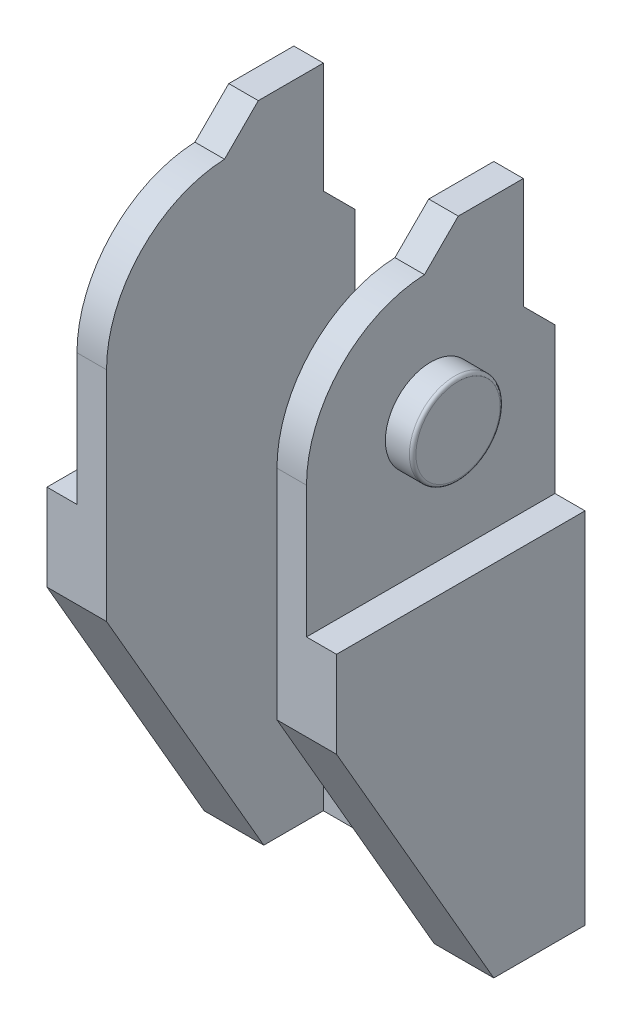
ISO-10303-21;
HEADER;
FILE_DESCRIPTION(('STEP AP214'),'2;1');
FILE_NAME('part.step','',(''),(''),'','','');
FILE_SCHEMA(('AUTOMOTIVE_DESIGN { 1 0 10303 214 1 1 1 1 }'));
ENDSEC;
DATA;
#1=APPLICATION_CONTEXT('core data for automotive mechanical design processes');
#2=APPLICATION_PROTOCOL_DEFINITION('international standard','automotive_design',2000,#1);
#3=PRODUCT_CONTEXT('',#1,'mechanical');
#4=PRODUCT('Part','Part','',(#3));
#5=PRODUCT_RELATED_PRODUCT_CATEGORY('part','',(#4));
#6=PRODUCT_DEFINITION_FORMATION('','',#4);
#7=PRODUCT_DEFINITION_CONTEXT('part definition',#1,'design');
#8=PRODUCT_DEFINITION('design','',#6,#7);
#9=PRODUCT_DEFINITION_SHAPE('','',#8);
#10=(LENGTH_UNIT() NAMED_UNIT(*) SI_UNIT(.MILLI.,.METRE.));
#11=(NAMED_UNIT(*) PLANE_ANGLE_UNIT() SI_UNIT($,.RADIAN.));
#12=(NAMED_UNIT(*) SI_UNIT($,.STERADIAN.) SOLID_ANGLE_UNIT());
#13=UNCERTAINTY_MEASURE_WITH_UNIT(LENGTH_MEASURE(1.E-05),#10,'distance_accuracy_value','');
#14=(GEOMETRIC_REPRESENTATION_CONTEXT(3) GLOBAL_UNCERTAINTY_ASSIGNED_CONTEXT((#13)) GLOBAL_UNIT_ASSIGNED_CONTEXT((#10,
#11,#12)) REPRESENTATION_CONTEXT('',''));
#15=CARTESIAN_POINT('',(0.,0.,0.));
#16=DIRECTION('',(0.,0.,1.));
#17=DIRECTION('',(1.,0.,0.));
#18=AXIS2_PLACEMENT_3D('',#15,#16,#17);
#19=CARTESIAN_POINT('',(5.25,2.16750000000027,15.31));
#20=DIRECTION('',(0.,0.,-1.));
#21=DIRECTION('',(-1.,0.,0.));
#22=AXIS2_PLACEMENT_3D('',#19,#20,#21);
#23=PLANE('',#22);
#24=DIRECTION('',(-1.,0.,0.));
#25=VECTOR('',#24,1.);
#26=CARTESIAN_POINT('',(8.92000000000003,10.2629827702437,15.3100000000815));
#27=LINE('',#26,#25);
#28=CARTESIAN_POINT('',(7.07,10.2629827702437,15.3100000000815));
#29=VERTEX_POINT('',#28);
#30=CARTESIAN_POINT('',(5.25,10.2629827702437,15.3100000000816));
#31=VERTEX_POINT('',#30);
#32=EDGE_CURVE('E256',#29,#31,#27,.T.);
#33=ORIENTED_EDGE('',*,*,#32,.T.);
#34=DIRECTION('',(0.,-1.,0.));
#35=VECTOR('',#34,1.);
#36=CARTESIAN_POINT('',(5.25,10.2629827701717,15.31));
#37=LINE('',#36,#35);
#38=CARTESIAN_POINT('',(5.25,-3.16749999999971,15.31));
#39=VERTEX_POINT('',#38);
#40=EDGE_CURVE('E359',#31,#39,#37,.T.);
#41=ORIENTED_EDGE('',*,*,#40,.T.);
#42=DIRECTION('',(-1.,0.,0.));
#43=VECTOR('',#42,1.);
#44=CARTESIAN_POINT('',(5.25,-3.16749999999971,15.31));
#45=LINE('',#44,#43);
#46=CARTESIAN_POINT('',(8.92000000000003,-3.16749999999971,15.3099999999999));
#47=VERTEX_POINT('',#46);
#48=EDGE_CURVE('E429',#47,#39,#45,.T.);
#49=ORIENTED_EDGE('',*,*,#48,.F.);
#50=DIRECTION('',(0.,-1.,0.));
#51=VECTOR('',#50,1.);
#52=CARTESIAN_POINT('',(8.92000000000003,2.16750000000027,15.31));
#53=LINE('',#52,#51);
#54=CARTESIAN_POINT('',(8.92000000000003,2.16750000000027,15.31));
#55=VERTEX_POINT('',#54);
#56=EDGE_CURVE('E410',#55,#47,#53,.T.);
#57=ORIENTED_EDGE('',*,*,#56,.F.);
#58=DIRECTION('',(1.,0.,0.));
#59=VECTOR('',#58,1.);
#60=CARTESIAN_POINT('',(7.07,2.16750000000027,15.3099999999999));
#61=LINE('',#60,#59);
#62=CARTESIAN_POINT('',(7.07,2.16750000000027,15.3099999999999));
#63=VERTEX_POINT('',#62);
#64=EDGE_CURVE('E294',#63,#55,#61,.T.);
#65=ORIENTED_EDGE('',*,*,#64,.F.);
#66=DIRECTION('',(0.,-1.,0.));
#67=VECTOR('',#66,1.);
#68=CARTESIAN_POINT('',(7.07,10.2629827701717,15.3099999999999));
#69=LINE('',#68,#67);
#70=EDGE_CURVE('E280',#29,#63,#69,.T.);
#71=ORIENTED_EDGE('',*,*,#70,.F.);
#72=EDGE_LOOP('',(#33,#41,#49,#57,#65,#71));
#73=FACE_BOUND('',#72,.T.);
#74=ADVANCED_FACE('F55',(#73),#23,.F.);
#75=CARTESIAN_POINT('',(5.25,-19.9474726521631,5.62207827597019));
#76=DIRECTION('',(0.,-0.499999999857117,0.866025403866932));
#77=DIRECTION('',(0.,-0.866025403866932,-0.499999999857117));
#78=AXIS2_PLACEMENT_3D('',#75,#76,#77);
#79=PLANE('',#78);
#80=DIRECTION('',(1.,0.,0.));
#81=VECTOR('',#80,1.);
#82=CARTESIAN_POINT('',(-8.92000000000002,-19.9474999999997,5.62206248299804));
#83=LINE('',#82,#81);
#84=CARTESIAN_POINT('',(-8.92000000000002,-19.9474999999997,5.62206248299804));
#85=VERTEX_POINT('',#84);
#86=CARTESIAN_POINT('',(-5.25000000000002,-19.9474999999997,5.62206248484359));
#87=VERTEX_POINT('',#86);
#88=EDGE_CURVE('E406',#85,#87,#83,.T.);
#89=ORIENTED_EDGE('',*,*,#88,.T.);
#90=DIRECTION('',(0.,-0.866025403784439,-0.5));
#91=VECTOR('',#90,1.);
#92=CARTESIAN_POINT('',(-5.25000000000003,-3.16749999999971,15.3099999999999));
#93=LINE('',#92,#91);
#94=CARTESIAN_POINT('',(-5.25000000000003,-3.16749999999971,15.3099999999999));
#95=VERTEX_POINT('',#94);
#96=EDGE_CURVE('E367',#95,#87,#93,.T.);
#97=ORIENTED_EDGE('',*,*,#96,.F.);
#98=CARTESIAN_POINT('',(-8.92000000000002,-3.16749999999971,15.31));
#99=VERTEX_POINT('',#98);
#100=EDGE_CURVE('E435',#95,#99,#45,.T.);
#101=ORIENTED_EDGE('',*,*,#100,.T.);
#102=DIRECTION('',(0.,0.866025403784438,0.500000000000001));
#103=VECTOR('',#102,1.);
#104=CARTESIAN_POINT('',(-8.92000000000002,-3.16749999999971,15.31));
#105=LINE('',#104,#103);
#106=EDGE_CURVE('E402',#85,#99,#105,.T.);
#107=ORIENTED_EDGE('',*,*,#106,.F.);
#108=EDGE_LOOP('',(#89,#97,#101,#107));
#109=FACE_BOUND('',#108,.T.);
#110=ADVANCED_FACE('F989',(#109),#79,.T.);
#111=DIRECTION('',(0.,-1.,0.));
#112=VECTOR('',#111,1.);
#113=CARTESIAN_POINT('',(-5.25000000000003,19.9475000000003,15.3099999999999));
#114=LINE('',#113,#112);
#115=CARTESIAN_POINT('',(-5.25000000000003,10.2629827701656,15.3099999999999));
#116=VERTEX_POINT('',#115);
#117=EDGE_CURVE('E363',#116,#95,#114,.T.);
#118=ORIENTED_EDGE('',*,*,#117,.F.);
#119=DIRECTION('',(1.,0.,0.));
#120=VECTOR('',#119,1.);
#121=CARTESIAN_POINT('',(-8.92000000000003,10.2629827701656,15.31));
#122=LINE('',#121,#120);
#123=CARTESIAN_POINT('',(-7.07000000000003,10.2629827701656,15.3099999999999));
#124=VERTEX_POINT('',#123);
#125=EDGE_CURVE('E322',#124,#116,#122,.T.);
#126=ORIENTED_EDGE('',*,*,#125,.F.);
#127=DIRECTION('',(0.,-1.,0.));
#128=VECTOR('',#127,1.);
#129=CARTESIAN_POINT('',(-7.07000000000003,19.9475000000003,15.3099999999999));
#130=LINE('',#129,#128);
#131=CARTESIAN_POINT('',(-7.07000000000003,2.16750000000027,15.31));
#132=VERTEX_POINT('',#131);
#133=EDGE_CURVE('E332',#124,#132,#130,.T.);
#134=ORIENTED_EDGE('',*,*,#133,.T.);
#135=DIRECTION('',(-1.,0.,0.));
#136=VECTOR('',#135,1.);
#137=CARTESIAN_POINT('',(-7.07000000000003,2.16750000000027,15.31));
#138=LINE('',#137,#136);
#139=CARTESIAN_POINT('',(-8.92000000000002,2.16750000000027,15.31));
#140=VERTEX_POINT('',#139);
#141=EDGE_CURVE('E335',#132,#140,#138,.T.);
#142=ORIENTED_EDGE('',*,*,#141,.T.);
#143=DIRECTION('',(0.,1.,0.));
#144=VECTOR('',#143,1.);
#145=CARTESIAN_POINT('',(-8.92000000000002,2.16750000000027,15.31));
#146=LINE('',#145,#144);
#147=EDGE_CURVE('E390',#99,#140,#146,.T.);
#148=ORIENTED_EDGE('',*,*,#147,.F.);
#149=ORIENTED_EDGE('',*,*,#100,.F.);
#150=EDGE_LOOP('',(#118,#126,#134,#142,#148,#149));
#151=FACE_BOUND('',#150,.T.);
#152=ADVANCED_FACE('F992',(#151),#23,.F.);
#153=CARTESIAN_POINT('',(0.,19.9475,-1.38777878078145E-13));
#154=DIRECTION('',(0.,-1.,0.));
#155=DIRECTION('',(0.,0.,-1.));
#156=AXIS2_PLACEMENT_3D('',#153,#154,#155);
#157=PLANE('',#156);
#158=DIRECTION('',(0.,0.,1.));
#159=VECTOR('',#158,1.);
#160=CARTESIAN_POINT('',(-5.25000000000002,19.9475000000003,5.9598041020909));
#161=LINE('',#160,#159);
#162=CARTESIAN_POINT('',(-5.25000000000002,19.9475000000002,1.94999999999987));
#163=VERTEX_POINT('',#162);
#164=CARTESIAN_POINT('',(-5.25000000000002,19.9474999999206,5.95980410201125));
#165=VERTEX_POINT('',#164);
#166=EDGE_CURVE('E360',#163,#165,#161,.T.);
#167=ORIENTED_EDGE('',*,*,#166,.F.);
#168=DIRECTION('',(1.,0.,0.));
#169=VECTOR('',#168,1.);
#170=CARTESIAN_POINT('',(-8.92000000000003,19.9475000000002,1.94999999999998));
#171=LINE('',#170,#169);
#172=CARTESIAN_POINT('',(-7.07000000000003,19.9475000000002,1.94999999999987));
#173=VERTEX_POINT('',#172);
#174=EDGE_CURVE('E229',#173,#163,#171,.T.);
#175=ORIENTED_EDGE('',*,*,#174,.F.);
#176=DIRECTION('',(0.,0.,-1.));
#177=VECTOR('',#176,1.);
#178=CARTESIAN_POINT('',(-7.07000000000003,19.9475000000003,15.3099999999999));
#179=LINE('',#178,#177);
#180=CARTESIAN_POINT('',(-7.07000000000003,19.9475000000003,5.95980410193159));
#181=VERTEX_POINT('',#180);
#182=EDGE_CURVE('E340',#181,#173,#179,.T.);
#183=ORIENTED_EDGE('',*,*,#182,.F.);
#184=DIRECTION('',(1.,0.,0.));
#185=VECTOR('',#184,1.);
#186=CARTESIAN_POINT('',(-8.92000000000004,19.9474999999206,5.95980410201136));
#187=LINE('',#186,#185);
#188=EDGE_CURVE('E326',#181,#165,#187,.T.);
#189=ORIENTED_EDGE('',*,*,#188,.T.);
#190=EDGE_LOOP('',(#167,#175,#183,#189));
#191=FACE_BOUND('',#190,.T.);
#192=ADVANCED_FACE('F1001',(#191),#157,.F.);
#193=CARTESIAN_POINT('',(0.,0.,0.));
#194=DIRECTION('',(0.,0.,1.));
#195=DIRECTION('',(1.,0.,0.));
#196=AXIS2_PLACEMENT_3D('',#193,#194,#195);
#197=PLANE('',#196);
#198=CARTESIAN_POINT('',(0.,-3.94713921133028,-2.16705264843853E-08));
#199=DIRECTION('',(0.,0.,1.));
#200=DIRECTION('',(1.,0.,0.));
#201=AXIS2_PLACEMENT_3D('',#198,#199,#200);
#202=CIRCLE('',#201,1.7);
#203=CARTESIAN_POINT('',(1.7,-3.94713921133028,-2.16705266979271E-08));
#204=VERTEX_POINT('',#203);
#205=EDGE_CURVE('E233',#204,#204,#202,.T.);
#206=ORIENTED_EDGE('',*,*,#205,.T.);
#207=EDGE_LOOP('',(#206));
#208=FACE_BOUND('',#207,.T.);
#209=CARTESIAN_POINT('',(0.,-12.9471392113303,-2.16704154620828E-08));
#210=DIRECTION('',(0.,0.,1.));
#211=DIRECTION('',(1.,0.,0.));
#212=AXIS2_PLACEMENT_3D('',#209,#210,#211);
#213=CIRCLE('',#212,1.7);
#214=CARTESIAN_POINT('',(1.7,-12.9471392113303,-2.16704156756247E-08));
#215=VERTEX_POINT('',#214);
#216=EDGE_CURVE('E1480',#215,#215,#213,.T.);
#217=ORIENTED_EDGE('',*,*,#216,.T.);
#218=EDGE_LOOP('',(#217));
#219=FACE_BOUND('',#218,.T.);
#220=DIRECTION('',(0.,-1.,0.));
#221=VECTOR('',#220,1.);
#222=CARTESIAN_POINT('',(-7.07000000000003,11.1675,-1.38777878078145E-13));
#223=LINE('',#222,#221);
#224=CARTESIAN_POINT('',(-7.07000000000003,11.1675,-1.38777878078145E-13));
#225=VERTEX_POINT('',#224);
#226=CARTESIAN_POINT('',(-7.07000000000003,2.16749999999999,-1.38777878078145E-13));
#227=VERTEX_POINT('',#226);
#228=EDGE_CURVE('E325',#225,#227,#223,.T.);
#229=ORIENTED_EDGE('',*,*,#228,.F.);
#230=DIRECTION('',(1.,0.,0.));
#231=VECTOR('',#230,1.);
#232=CARTESIAN_POINT('',(-8.92000000000003,11.1675,0.));
#233=LINE('',#232,#231);
#234=CARTESIAN_POINT('',(-5.25000000000002,11.1675,-1.38777878078145E-13));
#235=VERTEX_POINT('',#234);
#236=EDGE_CURVE('E71',#225,#235,#233,.T.);
#237=ORIENTED_EDGE('',*,*,#236,.T.);
#238=DIRECTION('',(0.,1.,0.));
#239=VECTOR('',#238,1.);
#240=CARTESIAN_POINT('',(-5.25000000000002,6.5672777077096,-2.16705264843853E-08));
#241=LINE('',#240,#239);
#242=CARTESIAN_POINT('',(-5.25000000000002,6.5672777077096,-2.16705264843853E-08));
#243=VERTEX_POINT('',#242);
#244=EDGE_CURVE('E239',#243,#235,#241,.T.);
#245=ORIENTED_EDGE('',*,*,#244,.F.);
#246=DIRECTION('',(1.,0.,0.));
#247=VECTOR('',#246,1.);
#248=CARTESIAN_POINT('',(-5.25000000000002,6.5672777077096,-2.16705264843853E-08));
#249=LINE('',#248,#247);
#250=CARTESIAN_POINT('',(5.25,6.5672777077096,-2.16703877065072E-08));
#251=VERTEX_POINT('',#250);
#252=EDGE_CURVE('E386',#243,#251,#249,.T.);
#253=ORIENTED_EDGE('',*,*,#252,.T.);
#254=DIRECTION('',(0.,1.,0.));
#255=VECTOR('',#254,1.);
#256=CARTESIAN_POINT('',(5.24999999999998,11.1672777077096,-2.16703877065072E-08));
#257=LINE('',#256,#255);
#258=CARTESIAN_POINT('',(5.24999999999998,11.1675,0.));
#259=VERTEX_POINT('',#258);
#260=EDGE_CURVE('E364',#251,#259,#257,.T.);
#261=ORIENTED_EDGE('',*,*,#260,.T.);
#262=DIRECTION('',(1.,0.,0.));
#263=VECTOR('',#262,1.);
#264=CARTESIAN_POINT('',(-8.92100000000002,11.1675,0.));
#265=LINE('',#264,#263);
#266=CARTESIAN_POINT('',(7.07,11.1675,-1.38777878078145E-13));
#267=VERTEX_POINT('',#266);
#268=EDGE_CURVE('E277',#259,#267,#265,.T.);
#269=ORIENTED_EDGE('',*,*,#268,.T.);
#270=DIRECTION('',(0.,-1.,0.));
#271=VECTOR('',#270,1.);
#272=CARTESIAN_POINT('',(7.07,19.9475,-2.16705542399609E-08));
#273=LINE('',#272,#271);
#274=CARTESIAN_POINT('',(7.07,2.16749999999999,-2.16705264843853E-08));
#275=VERTEX_POINT('',#274);
#276=EDGE_CURVE('E290',#267,#275,#273,.T.);
#277=ORIENTED_EDGE('',*,*,#276,.T.);
#278=DIRECTION('',(1.,0.,0.));
#279=VECTOR('',#278,1.);
#280=CARTESIAN_POINT('',(7.07,2.16749999999999,-2.16705264843853E-08));
#281=LINE('',#280,#279);
#282=CARTESIAN_POINT('',(8.92000000000003,2.16749999999999,-2.16704154620828E-08));
#283=VERTEX_POINT('',#282);
#284=EDGE_CURVE('E293',#275,#283,#281,.T.);
#285=ORIENTED_EDGE('',*,*,#284,.T.);
#286=DIRECTION('',(0.,1.,0.));
#287=VECTOR('',#286,1.);
#288=CARTESIAN_POINT('',(8.92000000000003,2.16749999999999,0.));
#289=LINE('',#288,#287);
#290=CARTESIAN_POINT('',(8.92000000000003,-19.9475,-1.38777878078145E-13));
#291=VERTEX_POINT('',#290);
#292=EDGE_CURVE('E420',#291,#283,#289,.T.);
#293=ORIENTED_EDGE('',*,*,#292,.F.);
#294=DIRECTION('',(-1.,0.,0.));
#295=VECTOR('',#294,1.);
#296=CARTESIAN_POINT('',(-5.25000000000002,-19.9475,-1.38777878078145E-13));
#297=LINE('',#296,#295);
#298=CARTESIAN_POINT('',(-8.92000000000002,-19.9475,0.));
#299=VERTEX_POINT('',#298);
#300=EDGE_CURVE('E428',#291,#299,#297,.T.);
#301=ORIENTED_EDGE('',*,*,#300,.T.);
#302=DIRECTION('',(0.,-1.,0.));
#303=VECTOR('',#302,1.);
#304=CARTESIAN_POINT('',(-8.92000000000003,2.16749999999999,0.));
#305=LINE('',#304,#303);
#306=CARTESIAN_POINT('',(-8.92000000000003,2.16749999999999,0.));
#307=VERTEX_POINT('',#306);
#308=EDGE_CURVE('E396',#307,#299,#305,.T.);
#309=ORIENTED_EDGE('',*,*,#308,.F.);
#310=DIRECTION('',(-1.,0.,0.));
#311=VECTOR('',#310,1.);
#312=CARTESIAN_POINT('',(-7.07000000000003,2.16749999999999,-1.38777878078145E-13));
#313=LINE('',#312,#311);
#314=EDGE_CURVE('E336',#227,#307,#313,.T.);
#315=ORIENTED_EDGE('',*,*,#314,.F.);
#316=EDGE_LOOP('',(#229,#237,#245,#253,#261,#269,#277,#285,#293,#301,#309,#315));
#317=FACE_BOUND('',#316,.T.);
#318=ADVANCED_FACE('F1006',(#208,#219,#317),#197,.F.);
#319=DIRECTION('',(0.,-0.866025403784439,-0.5));
#320=VECTOR('',#319,1.);
#321=CARTESIAN_POINT('',(5.25,-3.16749999999971,15.31));
#322=LINE('',#321,#320);
#323=CARTESIAN_POINT('',(5.25,-19.9474999999997,5.6220624848437));
#324=VERTEX_POINT('',#323);
#325=EDGE_CURVE('E377',#39,#324,#322,.T.);
#326=ORIENTED_EDGE('',*,*,#325,.T.);
#327=DIRECTION('',(-1.,0.,0.));
#328=VECTOR('',#327,1.);
#329=CARTESIAN_POINT('',(8.92000000000002,-19.9474999999997,5.62206248299793));
#330=LINE('',#329,#328);
#331=CARTESIAN_POINT('',(8.92000000000002,-19.9474999999997,5.62206248299793));
#332=VERTEX_POINT('',#331);
#333=EDGE_CURVE('E424',#332,#324,#330,.T.);
#334=ORIENTED_EDGE('',*,*,#333,.F.);
#335=DIRECTION('',(0.,-0.866025403784438,-0.500000000000001));
#336=VECTOR('',#335,1.);
#337=CARTESIAN_POINT('',(8.92000000000002,-19.9474999999997,5.62206248299793));
#338=LINE('',#337,#336);
#339=EDGE_CURVE('E413',#47,#332,#338,.T.);
#340=ORIENTED_EDGE('',*,*,#339,.F.);
#341=ORIENTED_EDGE('',*,*,#48,.T.);
#342=EDGE_LOOP('',(#326,#334,#340,#341));
#343=FACE_BOUND('',#342,.T.);
#344=ADVANCED_FACE('F998',(#343),#79,.T.);
#345=CARTESIAN_POINT('',(-5.25000000000002,-19.9475,-1.38777878078145E-13));
#346=DIRECTION('',(0.,1.,0.));
#347=DIRECTION('',(0.,0.,1.));
#348=AXIS2_PLACEMENT_3D('',#345,#346,#347);
#349=PLANE('',#348);
#350=DIRECTION('',(1.,0.,0.));
#351=VECTOR('',#350,1.);
#352=CARTESIAN_POINT('',(-5.25000000000002,-19.9474999999997,1.94999997832951));
#353=LINE('',#352,#351);
#354=CARTESIAN_POINT('',(-5.25000000000002,-19.9474999999997,1.94999997832951));
#355=VERTEX_POINT('',#354);
#356=CARTESIAN_POINT('',(5.25,-19.9474999999997,1.94999997832962));
#357=VERTEX_POINT('',#356);
#358=EDGE_CURVE('E434',#355,#357,#353,.T.);
#359=ORIENTED_EDGE('',*,*,#358,.F.);
#360=DIRECTION('',(0.,0.,-1.));
#361=VECTOR('',#360,1.);
#362=CARTESIAN_POINT('',(-5.25000000000002,-19.9475,-1.38777878078145E-13));
#363=LINE('',#362,#361);
#364=EDGE_CURVE('E926',#87,#355,#363,.T.);
#365=ORIENTED_EDGE('',*,*,#364,.F.);
#366=ORIENTED_EDGE('',*,*,#88,.F.);
#367=DIRECTION('',(0.,0.,1.));
#368=VECTOR('',#367,1.);
#369=CARTESIAN_POINT('',(-8.92000000000002,-19.9474999999997,5.62206248299804));
#370=LINE('',#369,#368);
#371=EDGE_CURVE('E399',#299,#85,#370,.T.);
#372=ORIENTED_EDGE('',*,*,#371,.F.);
#373=ORIENTED_EDGE('',*,*,#300,.F.);
#374=DIRECTION('',(0.,0.,-1.));
#375=VECTOR('',#374,1.);
#376=CARTESIAN_POINT('',(8.92000000000003,-19.9475,-1.38777878078145E-13));
#377=LINE('',#376,#375);
#378=EDGE_CURVE('E416',#332,#291,#377,.T.);
#379=ORIENTED_EDGE('',*,*,#378,.F.);
#380=ORIENTED_EDGE('',*,*,#333,.T.);
#381=DIRECTION('',(0.,0.,1.));
#382=VECTOR('',#381,1.);
#383=CARTESIAN_POINT('',(5.25,-19.9475,0.));
#384=LINE('',#383,#382);
#385=EDGE_CURVE('E922',#324,#357,#384,.F.);
#386=ORIENTED_EDGE('',*,*,#385,.T.);
#387=EDGE_LOOP('',(#359,#365,#366,#372,#373,#379,#380,#386));
#388=FACE_BOUND('',#387,.T.);
#389=ADVANCED_FACE('F1022',(#388),#349,.F.);
#390=CARTESIAN_POINT('',(8.92000000000003,0.,0.));
#391=DIRECTION('',(-1.,0.,0.));
#392=DIRECTION('',(0.,0.,1.));
#393=AXIS2_PLACEMENT_3D('',#390,#391,#392);
#394=PLANE('',#393);
#395=ORIENTED_EDGE('',*,*,#292,.T.);
#396=DIRECTION('',(0.,0.,1.));
#397=VECTOR('',#396,1.);
#398=CARTESIAN_POINT('',(8.92000000000003,2.16749999999999,-2.16704154620828E-08));
#399=LINE('',#398,#397);
#400=EDGE_CURVE('E303',#283,#55,#399,.T.);
#401=ORIENTED_EDGE('',*,*,#400,.T.);
#402=ORIENTED_EDGE('',*,*,#56,.T.);
#403=ORIENTED_EDGE('',*,*,#339,.T.);
#404=ORIENTED_EDGE('',*,*,#378,.T.);
#405=EDGE_LOOP('',(#395,#401,#402,#403,#404));
#406=FACE_BOUND('',#405,.T.);
#407=ADVANCED_FACE('F1045',(#406),#394,.F.);
#408=CARTESIAN_POINT('',(-8.92000000000003,0.,0.));
#409=DIRECTION('',(1.,0.,0.));
#410=DIRECTION('',(0.,0.,-1.));
#411=AXIS2_PLACEMENT_3D('',#408,#409,#410);
#412=PLANE('',#411);
#413=ORIENTED_EDGE('',*,*,#147,.T.);
#414=DIRECTION('',(0.,0.,-1.));
#415=VECTOR('',#414,1.);
#416=CARTESIAN_POINT('',(-8.92000000000002,2.16750000000027,15.31));
#417=LINE('',#416,#415);
#418=EDGE_CURVE('E345',#140,#307,#417,.T.);
#419=ORIENTED_EDGE('',*,*,#418,.T.);
#420=ORIENTED_EDGE('',*,*,#308,.T.);
#421=ORIENTED_EDGE('',*,*,#371,.T.);
#422=ORIENTED_EDGE('',*,*,#106,.T.);
#423=EDGE_LOOP('',(#413,#419,#420,#421,#422));
#424=FACE_BOUND('',#423,.T.);
#425=ADVANCED_FACE('F1041',(#424),#412,.F.);
#426=CARTESIAN_POINT('',(5.25,4.61727770770953,-2.16703877065072E-08));
#427=DIRECTION('',(1.,0.,0.));
#428=DIRECTION('',(0.,0.,-1.));
#429=AXIS2_PLACEMENT_3D('',#426,#427,#428);
#430=PLANE('',#429);
#431=ORIENTED_EDGE('',*,*,#40,.F.);
#432=CARTESIAN_POINT('',(5.25,10.2629827702435,7.70105335394347));
#433=DIRECTION('',(1.,0.,0.));
#434=DIRECTION('',(0.,0.,-1.));
#435=AXIS2_PLACEMENT_3D('',#432,#433,#434);
#436=CIRCLE('',#435,7.60894664613818);
#437=CARTESIAN_POINT('',(5.24999999999999,17.8642390521744,8.04306504991667));
#438=VERTEX_POINT('',#437);
#439=EDGE_CURVE('E248',#438,#31,#436,.T.);
#440=ORIENTED_EDGE('',*,*,#439,.F.);
#441=DIRECTION('',(0.,-0.707106781186543,0.707106781186552));
#442=VECTOR('',#441,1.);
#443=CARTESIAN_POINT('',(5.24999999999998,19.9475000000003,5.95980410209101));
#444=LINE('',#443,#442);
#445=CARTESIAN_POINT('',(5.24999999999998,19.9475000000003,5.95980410209101));
#446=VERTEX_POINT('',#445);
#447=EDGE_CURVE('E253',#446,#438,#444,.T.);
#448=ORIENTED_EDGE('',*,*,#447,.F.);
#449=DIRECTION('',(0.,0.,1.));
#450=VECTOR('',#449,1.);
#451=CARTESIAN_POINT('',(5.25,19.9475000000002,1.94999999999998));
#452=LINE('',#451,#450);
#453=CARTESIAN_POINT('',(5.25,19.9475000000002,1.94999999999998));
#454=VERTEX_POINT('',#453);
#455=EDGE_CURVE('E349',#454,#446,#452,.T.);
#456=ORIENTED_EDGE('',*,*,#455,.F.);
#457=DIRECTION('',(0.,1.,0.));
#458=VECTOR('',#457,1.);
#459=CARTESIAN_POINT('',(5.25,19.9475000000002,1.94999999999998));
#460=LINE('',#459,#458);
#461=CARTESIAN_POINT('',(5.25,13.1175000000003,1.94999999999998));
#462=VERTEX_POINT('',#461);
#463=EDGE_CURVE('E270',#462,#454,#460,.T.);
#464=ORIENTED_EDGE('',*,*,#463,.F.);
#465=DIRECTION('',(0.,0.707106781186546,0.707106781186549));
#466=VECTOR('',#465,1.);
#467=CARTESIAN_POINT('',(5.25,13.1175000000003,1.94999999999998));
#468=LINE('',#467,#466);
#469=EDGE_CURVE('E266',#259,#462,#468,.T.);
#470=ORIENTED_EDGE('',*,*,#469,.F.);
#471=ORIENTED_EDGE('',*,*,#260,.F.);
#472=CARTESIAN_POINT('',(5.25,4.61727770770953,-2.16703877065072E-08));
#473=DIRECTION('',(-1.,0.,0.));
#474=DIRECTION('',(0.,0.,-1.));
#475=AXIS2_PLACEMENT_3D('',#472,#473,#474);
#476=CIRCLE('',#475,1.95000000000003);
#477=CARTESIAN_POINT('',(5.25,4.61727770770981,1.94999997832965));
#478=VERTEX_POINT('',#477);
#479=EDGE_CURVE('E378',#478,#251,#476,.T.);
#480=ORIENTED_EDGE('',*,*,#479,.F.);
#481=DIRECTION('',(0.,1.,0.));
#482=VECTOR('',#481,1.);
#483=CARTESIAN_POINT('',(5.25,-19.9474726505648,1.94999997832962));
#484=LINE('',#483,#482);
#485=EDGE_CURVE('E382',#357,#478,#484,.T.);
#486=ORIENTED_EDGE('',*,*,#485,.F.);
#487=ORIENTED_EDGE('',*,*,#385,.F.);
#488=ORIENTED_EDGE('',*,*,#325,.F.);
#489=EDGE_LOOP('',(#431,#440,#448,#456,#464,#470,#471,#480,#486,#487,#488));
#490=FACE_BOUND('',#489,.T.);
#491=ADVANCED_FACE('F1054',(#490),#430,.F.);
#492=CARTESIAN_POINT('',(-5.25000000000002,4.61727770770953,-2.16704154620828E-08));
#493=DIRECTION('',(1.,0.,0.));
#494=DIRECTION('',(0.,0.,-1.));
#495=AXIS2_PLACEMENT_3D('',#492,#493,#494);
#496=CYLINDRICAL_SURFACE('',#495,1.95000000000003);
#497=ORIENTED_EDGE('',*,*,#479,.T.);
#498=ORIENTED_EDGE('',*,*,#252,.F.);
#499=CARTESIAN_POINT('',(-5.25000000000002,4.61727770770953,-2.16704154620828E-08));
#500=DIRECTION('',(-1.,0.,0.));
#501=DIRECTION('',(0.,0.,-1.));
#502=AXIS2_PLACEMENT_3D('',#499,#500,#501);
#503=CIRCLE('',#502,1.95000000000003);
#504=CARTESIAN_POINT('',(-5.25000000000002,4.61727770770981,1.94999997832962));
#505=VERTEX_POINT('',#504);
#506=EDGE_CURVE('E368',#505,#243,#503,.T.);
#507=ORIENTED_EDGE('',*,*,#506,.F.);
#508=DIRECTION('',(1.,0.,0.));
#509=VECTOR('',#508,1.);
#510=CARTESIAN_POINT('',(-5.25000000000002,4.61727770770981,1.94999997832962));
#511=LINE('',#510,#509);
#512=EDGE_CURVE('E374',#505,#478,#511,.T.);
#513=ORIENTED_EDGE('',*,*,#512,.T.);
#514=EDGE_LOOP('',(#497,#498,#507,#513));
#515=FACE_BOUND('',#514,.T.);
#516=ADVANCED_FACE('F1029',(#515),#496,.T.);
#517=CARTESIAN_POINT('',(-5.25000000000002,-19.9474726505648,1.94999997832951));
#518=DIRECTION('',(0.,0.,-1.));
#519=DIRECTION('',(0.,1.,0.));
#520=AXIS2_PLACEMENT_3D('',#517,#518,#519);
#521=PLANE('',#520);
#522=CARTESIAN_POINT('',(0.,-3.94713921133005,1.94999997832951));
#523=DIRECTION('',(0.,0.,1.));
#524=DIRECTION('',(1.,0.,0.));
#525=AXIS2_PLACEMENT_3D('',#522,#523,#524);
#526=CIRCLE('',#525,1.7);
#527=CARTESIAN_POINT('',(1.69999999999999,-3.94713921133005,1.94999997832951));
#528=VERTEX_POINT('',#527);
#529=EDGE_CURVE('E1483',#528,#528,#526,.T.);
#530=ORIENTED_EDGE('',*,*,#529,.F.);
#531=EDGE_LOOP('',(#530));
#532=FACE_BOUND('',#531,.T.);
#533=CARTESIAN_POINT('',(0.,-12.9471392113301,1.94999997832962));
#534=DIRECTION('',(0.,0.,1.));
#535=DIRECTION('',(1.,0.,0.));
#536=AXIS2_PLACEMENT_3D('',#533,#534,#535);
#537=CIRCLE('',#536,1.7);
#538=CARTESIAN_POINT('',(1.69999999999999,-12.9471392113301,1.94999997832962));
#539=VERTEX_POINT('',#538);
#540=EDGE_CURVE('E1478',#539,#539,#537,.T.);
#541=ORIENTED_EDGE('',*,*,#540,.F.);
#542=EDGE_LOOP('',(#541));
#543=FACE_BOUND('',#542,.T.);
#544=ORIENTED_EDGE('',*,*,#485,.T.);
#545=ORIENTED_EDGE('',*,*,#512,.F.);
#546=DIRECTION('',(0.,1.,0.));
#547=VECTOR('',#546,1.);
#548=CARTESIAN_POINT('',(-5.25000000000002,-19.9474726505648,1.94999997832951));
#549=LINE('',#548,#547);
#550=EDGE_CURVE('E371',#355,#505,#549,.T.);
#551=ORIENTED_EDGE('',*,*,#550,.F.);
#552=ORIENTED_EDGE('',*,*,#358,.T.);
#553=EDGE_LOOP('',(#544,#545,#551,#552));
#554=FACE_BOUND('',#553,.T.);
#555=ADVANCED_FACE('F1025',(#532,#543,#554),#521,.F.);
#556=CARTESIAN_POINT('',(-5.25000000000002,4.61727770770953,-2.16704154620828E-08));
#557=DIRECTION('',(1.,0.,0.));
#558=DIRECTION('',(0.,0.,-1.));
#559=AXIS2_PLACEMENT_3D('',#556,#557,#558);
#560=PLANE('',#559);
#561=DIRECTION('',(0.,-1.,0.));
#562=VECTOR('',#561,1.);
#563=CARTESIAN_POINT('',(-5.25000000000002,19.9475000000002,1.94999999999987));
#564=LINE('',#563,#562);
#565=CARTESIAN_POINT('',(-5.25000000000002,13.1175000000003,1.94999999999987));
#566=VERTEX_POINT('',#565);
#567=EDGE_CURVE('E226',#163,#566,#564,.T.);
#568=ORIENTED_EDGE('',*,*,#567,.F.);
#569=ORIENTED_EDGE('',*,*,#166,.T.);
#570=DIRECTION('',(0.,0.707106781186557,-0.707106781186538));
#571=VECTOR('',#570,1.);
#572=CARTESIAN_POINT('',(-5.25000000000003,17.864239052018,8.04306504991353));
#573=LINE('',#572,#571);
#574=CARTESIAN_POINT('',(-5.25000000000003,17.864239052018,8.04306504991353));
#575=VERTEX_POINT('',#574);
#576=EDGE_CURVE('E317',#575,#165,#573,.T.);
#577=ORIENTED_EDGE('',*,*,#576,.F.);
#578=CARTESIAN_POINT('',(-5.25000000000002,10.2629827701654,7.70105335393984));
#579=DIRECTION('',(-1.,0.,0.));
#580=DIRECTION('',(0.,0.,-1.));
#581=AXIS2_PLACEMENT_3D('',#578,#579,#580);
#582=CIRCLE('',#581,7.60894664605998);
#583=EDGE_CURVE('E306',#116,#575,#582,.T.);
#584=ORIENTED_EDGE('',*,*,#583,.F.);
#585=ORIENTED_EDGE('',*,*,#117,.T.);
#586=ORIENTED_EDGE('',*,*,#96,.T.);
#587=ORIENTED_EDGE('',*,*,#364,.T.);
#588=ORIENTED_EDGE('',*,*,#550,.T.);
#589=ORIENTED_EDGE('',*,*,#506,.T.);
#590=ORIENTED_EDGE('',*,*,#244,.T.);
#591=DIRECTION('',(0.,-0.707106781186546,-0.707106781186549));
#592=VECTOR('',#591,1.);
#593=CARTESIAN_POINT('',(-5.25000000000002,13.1175000000003,1.94999999999987));
#594=LINE('',#593,#592);
#595=EDGE_CURVE('E219',#566,#235,#594,.T.);
#596=ORIENTED_EDGE('',*,*,#595,.F.);
#597=EDGE_LOOP('',(#568,#569,#577,#584,#585,#586,#587,#588,#589,#590,#596));
#598=FACE_BOUND('',#597,.T.);
#599=ADVANCED_FACE('F236',(#598),#560,.T.);
#600=CARTESIAN_POINT('',(0.,19.9475,-1.38777878078145E-13));
#601=DIRECTION('',(0.,-1.,0.));
#602=DIRECTION('',(0.,0.,-1.));
#603=AXIS2_PLACEMENT_3D('',#600,#601,#602);
#604=PLANE('',#603);
#605=ORIENTED_EDGE('',*,*,#455,.T.);
#606=DIRECTION('',(-1.,0.,0.));
#607=VECTOR('',#606,1.);
#608=CARTESIAN_POINT('',(8.92,19.9475000000003,5.9598041020909));
#609=LINE('',#608,#607);
#610=CARTESIAN_POINT('',(7.07,19.9475000000003,5.9598041020909));
#611=VERTEX_POINT('',#610);
#612=EDGE_CURVE('E260',#611,#446,#609,.T.);
#613=ORIENTED_EDGE('',*,*,#612,.F.);
#614=DIRECTION('',(0.,0.,1.));
#615=VECTOR('',#614,1.);
#616=CARTESIAN_POINT('',(7.07,19.9475,-2.16705542399609E-08));
#617=LINE('',#616,#615);
#618=CARTESIAN_POINT('',(7.07,19.9475000000002,1.94999999999984));
#619=VERTEX_POINT('',#618);
#620=EDGE_CURVE('E298',#619,#611,#617,.T.);
#621=ORIENTED_EDGE('',*,*,#620,.F.);
#622=DIRECTION('',(1.,0.,0.));
#623=VECTOR('',#622,1.);
#624=CARTESIAN_POINT('',(-8.92100000000002,19.9475000000002,1.94999999999998));
#625=LINE('',#624,#623);
#626=EDGE_CURVE('E281',#454,#619,#625,.T.);
#627=ORIENTED_EDGE('',*,*,#626,.F.);
#628=EDGE_LOOP('',(#605,#613,#621,#627));
#629=FACE_BOUND('',#628,.T.);
#630=ADVANCED_FACE('F1079',(#629),#604,.F.);
#631=CARTESIAN_POINT('',(-7.07000000000003,2.16750000000027,15.31));
#632=DIRECTION('',(0.,-1.,0.));
#633=DIRECTION('',(0.,0.,-1.));
#634=AXIS2_PLACEMENT_3D('',#631,#632,#633);
#635=PLANE('',#634);
#636=ORIENTED_EDGE('',*,*,#314,.T.);
#637=ORIENTED_EDGE('',*,*,#418,.F.);
#638=ORIENTED_EDGE('',*,*,#141,.F.);
#639=DIRECTION('',(0.,0.,-1.));
#640=VECTOR('',#639,1.);
#641=CARTESIAN_POINT('',(-7.07000000000003,2.16750000000027,15.31));
#642=LINE('',#641,#640);
#643=EDGE_CURVE('E350',#132,#227,#642,.T.);
#644=ORIENTED_EDGE('',*,*,#643,.T.);
#645=EDGE_LOOP('',(#636,#637,#638,#644));
#646=FACE_BOUND('',#645,.T.);
#647=ADVANCED_FACE('F1039',(#646),#635,.F.);
#648=CARTESIAN_POINT('',(-7.07000000000003,11.1675000000003,15.3099999999999));
#649=DIRECTION('',(1.,0.,0.));
#650=DIRECTION('',(0.,0.,-1.));
#651=AXIS2_PLACEMENT_3D('',#648,#649,#650);
#652=PLANE('',#651);
#653=CARTESIAN_POINT('',(-7.07000000000003,10.2125,7.65499999999986));
#654=DIRECTION('',(1.,0.,0.));
#655=DIRECTION('',(0.,0.,-1.));
#656=AXIS2_PLACEMENT_3D('',#653,#654,#655);
#657=CIRCLE('',#656,2.795);
#658=CARTESIAN_POINT('',(-7.07000000000003,10.2125,4.85999999999986));
#659=VERTEX_POINT('',#658);
#660=EDGE_CURVE('E953',#659,#659,#657,.F.);
#661=ORIENTED_EDGE('',*,*,#660,.F.);
#662=EDGE_LOOP('',(#661));
#663=FACE_BOUND('',#662,.T.);
#664=ORIENTED_EDGE('',*,*,#182,.T.);
#665=DIRECTION('',(0.,-1.,0.));
#666=VECTOR('',#665,1.);
#667=CARTESIAN_POINT('',(-7.07000000000003,11.1675000000003,1.94999999999987));
#668=LINE('',#667,#666);
#669=CARTESIAN_POINT('',(-7.07000000000003,13.1175000000003,1.94999999999987));
#670=VERTEX_POINT('',#669);
#671=EDGE_CURVE('E950',#173,#670,#668,.T.);
#672=ORIENTED_EDGE('',*,*,#671,.T.);
#673=DIRECTION('',(0.,-0.707106781186546,-0.707106781186549));
#674=VECTOR('',#673,1.);
#675=CARTESIAN_POINT('',(-7.07000000000003,18.8225,7.65499999999988));
#676=LINE('',#675,#674);
#677=EDGE_CURVE('E220',#670,#225,#676,.T.);
#678=ORIENTED_EDGE('',*,*,#677,.T.);
#679=ORIENTED_EDGE('',*,*,#228,.T.);
#680=ORIENTED_EDGE('',*,*,#643,.F.);
#681=ORIENTED_EDGE('',*,*,#133,.F.);
#682=CARTESIAN_POINT('',(-7.07000000000003,10.2629827701654,7.70105335393984));
#683=DIRECTION('',(1.,0.,0.));
#684=DIRECTION('',(0.,0.,-1.));
#685=AXIS2_PLACEMENT_3D('',#682,#683,#684);
#686=CIRCLE('',#685,7.60894664605998);
#687=CARTESIAN_POINT('',(-7.07000000000003,17.864239052018,8.04306504991353));
#688=VERTEX_POINT('',#687);
#689=EDGE_CURVE('E936',#124,#688,#686,.F.);
#690=ORIENTED_EDGE('',*,*,#689,.T.);
#691=DIRECTION('',(0.,0.707106781186557,-0.707106781186538));
#692=VECTOR('',#691,1.);
#693=CARTESIAN_POINT('',(-7.07000000000003,10.882402050966,15.0249020509656));
#694=LINE('',#693,#692);
#695=EDGE_CURVE('E930',#688,#181,#694,.T.);
#696=ORIENTED_EDGE('',*,*,#695,.T.);
#697=EDGE_LOOP('',(#664,#672,#678,#679,#680,#681,#690,#696));
#698=FACE_BOUND('',#697,.T.);
#699=ADVANCED_FACE('F1036',(#663,#698),#652,.F.);
#700=CARTESIAN_POINT('',(-8.92000000000003,10.2629827701654,7.70105335393995));
#701=DIRECTION('',(1.,0.,0.));
#702=DIRECTION('',(0.,0.,-1.));
#703=AXIS2_PLACEMENT_3D('',#700,#701,#702);
#704=CYLINDRICAL_SURFACE('',#703,7.60894664605998);
#705=ORIENTED_EDGE('',*,*,#125,.T.);
#706=ORIENTED_EDGE('',*,*,#583,.T.);
#707=DIRECTION('',(1.,0.,0.));
#708=VECTOR('',#707,1.);
#709=CARTESIAN_POINT('',(-8.92000000000004,17.864239052018,8.04306504991365));
#710=LINE('',#709,#708);
#711=EDGE_CURVE('E321',#688,#575,#710,.T.);
#712=ORIENTED_EDGE('',*,*,#711,.F.);
#713=ORIENTED_EDGE('',*,*,#689,.F.);
#714=EDGE_LOOP('',(#705,#706,#712,#713));
#715=FACE_BOUND('',#714,.T.);
#716=ADVANCED_FACE('F1099',(#715),#704,.T.);
#717=CARTESIAN_POINT('',(-8.92000000000004,17.864239052018,8.04306504991365));
#718=DIRECTION('',(0.,-0.707106781186538,-0.707106781186557));
#719=DIRECTION('',(0.,0.707106781186557,-0.707106781186538));
#720=AXIS2_PLACEMENT_3D('',#717,#718,#719);
#721=PLANE('',#720);
#722=ORIENTED_EDGE('',*,*,#711,.T.);
#723=ORIENTED_EDGE('',*,*,#576,.T.);
#724=ORIENTED_EDGE('',*,*,#188,.F.);
#725=ORIENTED_EDGE('',*,*,#695,.F.);
#726=EDGE_LOOP('',(#722,#723,#724,#725));
#727=FACE_BOUND('',#726,.T.);
#728=ADVANCED_FACE('F1095',(#727),#721,.F.);
#729=CARTESIAN_POINT('',(7.07,2.16749999999999,-2.16705264843853E-08));
#730=DIRECTION('',(0.,-1.,0.));
#731=DIRECTION('',(0.,0.,-1.));
#732=AXIS2_PLACEMENT_3D('',#729,#730,#731);
#733=PLANE('',#732);
#734=ORIENTED_EDGE('',*,*,#64,.T.);
#735=ORIENTED_EDGE('',*,*,#400,.F.);
#736=ORIENTED_EDGE('',*,*,#284,.F.);
#737=DIRECTION('',(0.,0.,1.));
#738=VECTOR('',#737,1.);
#739=CARTESIAN_POINT('',(7.07,2.16749999999999,-2.16705264843853E-08));
#740=LINE('',#739,#738);
#741=EDGE_CURVE('E307',#275,#63,#740,.T.);
#742=ORIENTED_EDGE('',*,*,#741,.T.);
#743=EDGE_LOOP('',(#734,#735,#736,#742));
#744=FACE_BOUND('',#743,.T.);
#745=ADVANCED_FACE('F1070',(#744),#733,.F.);
#746=CARTESIAN_POINT('',(7.07,10.2629827701714,-2.16705542399609E-08));
#747=DIRECTION('',(-1.,0.,0.));
#748=DIRECTION('',(0.,0.,1.));
#749=AXIS2_PLACEMENT_3D('',#746,#747,#748);
#750=PLANE('',#749);
#751=CARTESIAN_POINT('',(7.07,10.2125,7.65499999999986));
#752=DIRECTION('',(-1.,0.,0.));
#753=DIRECTION('',(0.,0.,1.));
#754=AXIS2_PLACEMENT_3D('',#751,#752,#753);
#755=CIRCLE('',#754,2.795);
#756=CARTESIAN_POINT('',(7.07,10.2125,10.4499999999999));
#757=VERTEX_POINT('',#756);
#758=EDGE_CURVE('E957',#757,#757,#755,.F.);
#759=ORIENTED_EDGE('',*,*,#758,.F.);
#760=EDGE_LOOP('',(#759));
#761=FACE_BOUND('',#760,.T.);
#762=DIRECTION('',(0.,-0.707106781186543,0.707106781186552));
#763=VECTOR('',#762,1.);
#764=CARTESIAN_POINT('',(7.07,18.0851434469665,7.82216065512445));
#765=LINE('',#764,#763);
#766=CARTESIAN_POINT('',(7.07,17.8642390521744,8.04306504991653));
#767=VERTEX_POINT('',#766);
#768=EDGE_CURVE('E940',#611,#767,#765,.T.);
#769=ORIENTED_EDGE('',*,*,#768,.T.);
#770=CARTESIAN_POINT('',(7.07,10.2629827702435,7.70105335394333));
#771=DIRECTION('',(-1.,0.,0.));
#772=DIRECTION('',(0.,0.,1.));
#773=AXIS2_PLACEMENT_3D('',#770,#771,#772);
#774=CIRCLE('',#773,7.60894664613818);
#775=EDGE_CURVE('E944',#767,#29,#774,.F.);
#776=ORIENTED_EDGE('',*,*,#775,.T.);
#777=ORIENTED_EDGE('',*,*,#70,.T.);
#778=ORIENTED_EDGE('',*,*,#741,.F.);
#779=ORIENTED_EDGE('',*,*,#276,.F.);
#780=DIRECTION('',(0.,-0.707106781186546,-0.707106781186549));
#781=VECTOR('',#780,1.);
#782=CARTESIAN_POINT('',(7.07,13.1175000000003,1.94999999999987));
#783=LINE('',#782,#781);
#784=CARTESIAN_POINT('',(7.07,13.1175000000003,1.94999999999987));
#785=VERTEX_POINT('',#784);
#786=EDGE_CURVE('E271',#785,#267,#783,.T.);
#787=ORIENTED_EDGE('',*,*,#786,.F.);
#788=DIRECTION('',(0.,-1.,0.));
#789=VECTOR('',#788,1.);
#790=CARTESIAN_POINT('',(7.07,19.9475000000002,1.94999999999984));
#791=LINE('',#790,#789);
#792=EDGE_CURVE('E274',#619,#785,#791,.T.);
#793=ORIENTED_EDGE('',*,*,#792,.F.);
#794=ORIENTED_EDGE('',*,*,#620,.T.);
#795=EDGE_LOOP('',(#769,#776,#777,#778,#779,#787,#793,#794));
#796=FACE_BOUND('',#795,.T.);
#797=ADVANCED_FACE('F1064',(#761,#796),#750,.F.);
#798=CARTESIAN_POINT('',(-8.92100000000002,19.9475000000002,1.94999999999998));
#799=DIRECTION('',(0.,0.,1.));
#800=DIRECTION('',(1.,0.,0.));
#801=AXIS2_PLACEMENT_3D('',#798,#799,#800);
#802=PLANE('',#801);
#803=ORIENTED_EDGE('',*,*,#463,.T.);
#804=ORIENTED_EDGE('',*,*,#626,.T.);
#805=ORIENTED_EDGE('',*,*,#792,.T.);
#806=DIRECTION('',(1.,0.,0.));
#807=VECTOR('',#806,1.);
#808=CARTESIAN_POINT('',(-8.92100000000002,13.1175000000003,1.95000000000001));
#809=LINE('',#808,#807);
#810=EDGE_CURVE('E259',#462,#785,#809,.T.);
#811=ORIENTED_EDGE('',*,*,#810,.F.);
#812=EDGE_LOOP('',(#803,#804,#805,#811));
#813=FACE_BOUND('',#812,.T.);
#814=ADVANCED_FACE('F1082',(#813),#802,.F.);
#815=CARTESIAN_POINT('',(-8.92100000000002,13.1175000000003,1.95000000000001));
#816=DIRECTION('',(0.,-0.707106781186549,0.707106781186546));
#817=DIRECTION('',(0.,-0.707106781186546,-0.707106781186549));
#818=AXIS2_PLACEMENT_3D('',#815,#816,#817);
#819=PLANE('',#818);
#820=ORIENTED_EDGE('',*,*,#469,.T.);
#821=ORIENTED_EDGE('',*,*,#810,.T.);
#822=ORIENTED_EDGE('',*,*,#786,.T.);
#823=ORIENTED_EDGE('',*,*,#268,.F.);
#824=EDGE_LOOP('',(#820,#821,#822,#823));
#825=FACE_BOUND('',#824,.T.);
#826=ADVANCED_FACE('F1059',(#825),#819,.F.);
#827=CARTESIAN_POINT('',(8.92000000000002,10.2629827702435,7.70105335394333));
#828=DIRECTION('',(-1.,0.,0.));
#829=DIRECTION('',(0.,0.,1.));
#830=AXIS2_PLACEMENT_3D('',#827,#828,#829);
#831=CYLINDRICAL_SURFACE('',#830,7.60894664613818);
#832=DIRECTION('',(-1.,0.,0.));
#833=VECTOR('',#832,1.);
#834=CARTESIAN_POINT('',(8.92,17.8642390521744,8.04306504991656));
#835=LINE('',#834,#833);
#836=EDGE_CURVE('E79',#767,#438,#835,.T.);
#837=ORIENTED_EDGE('',*,*,#836,.T.);
#838=ORIENTED_EDGE('',*,*,#439,.T.);
#839=ORIENTED_EDGE('',*,*,#32,.F.);
#840=ORIENTED_EDGE('',*,*,#775,.F.);
#841=EDGE_LOOP('',(#837,#838,#839,#840));
#842=FACE_BOUND('',#841,.T.);
#843=ADVANCED_FACE('F1074',(#842),#831,.T.);
#844=CARTESIAN_POINT('',(8.92,19.9475000000003,5.9598041020909));
#845=DIRECTION('',(0.,-0.707106781186552,-0.707106781186543));
#846=DIRECTION('',(0.,0.707106781186543,-0.707106781186552));
#847=AXIS2_PLACEMENT_3D('',#844,#845,#846);
#848=PLANE('',#847);
#849=ORIENTED_EDGE('',*,*,#612,.T.);
#850=ORIENTED_EDGE('',*,*,#447,.T.);
#851=ORIENTED_EDGE('',*,*,#836,.F.);
#852=ORIENTED_EDGE('',*,*,#768,.F.);
#853=EDGE_LOOP('',(#849,#850,#851,#852));
#854=FACE_BOUND('',#853,.T.);
#855=ADVANCED_FACE('F1075',(#854),#848,.F.);
#856=CARTESIAN_POINT('',(-8.92000000000003,19.9475000000002,1.94999999999998));
#857=DIRECTION('',(0.,0.,1.));
#858=DIRECTION('',(1.,0.,0.));
#859=AXIS2_PLACEMENT_3D('',#856,#857,#858);
#860=PLANE('',#859);
#861=ORIENTED_EDGE('',*,*,#174,.T.);
#862=ORIENTED_EDGE('',*,*,#567,.T.);
#863=DIRECTION('',(1.,0.,0.));
#864=VECTOR('',#863,1.);
#865=CARTESIAN_POINT('',(-8.92000000000003,13.1175000000003,1.95000000000001));
#866=LINE('',#865,#864);
#867=EDGE_CURVE('E215',#670,#566,#866,.T.);
#868=ORIENTED_EDGE('',*,*,#867,.F.);
#869=ORIENTED_EDGE('',*,*,#671,.F.);
#870=EDGE_LOOP('',(#861,#862,#868,#869));
#871=FACE_BOUND('',#870,.T.);
#872=ADVANCED_FACE('F227',(#871),#860,.F.);
#873=CARTESIAN_POINT('',(-8.92000000000003,13.1175000000003,1.95000000000001));
#874=DIRECTION('',(0.,-0.707106781186549,0.707106781186546));
#875=DIRECTION('',(0.,-0.707106781186546,-0.707106781186549));
#876=AXIS2_PLACEMENT_3D('',#873,#874,#875);
#877=PLANE('',#876);
#878=ORIENTED_EDGE('',*,*,#867,.T.);
#879=ORIENTED_EDGE('',*,*,#595,.T.);
#880=ORIENTED_EDGE('',*,*,#236,.F.);
#881=ORIENTED_EDGE('',*,*,#677,.F.);
#882=EDGE_LOOP('',(#878,#879,#880,#881));
#883=FACE_BOUND('',#882,.T.);
#884=ADVANCED_FACE('F217',(#883),#877,.F.);
#885=CARTESIAN_POINT('',(-8.75000000000003,10.2125,7.65499999999986));
#886=DIRECTION('',(1.,0.,0.));
#887=DIRECTION('',(0.,0.,-1.));
#888=AXIS2_PLACEMENT_3D('',#885,#886,#887);
#889=CYLINDRICAL_SURFACE('',#888,2.795);
#890=CARTESIAN_POINT('',(-8.55000000000003,10.2125,7.65499999999986));
#891=DIRECTION('',(-1.,0.,0.));
#892=DIRECTION('',(0.,0.,1.));
#893=AXIS2_PLACEMENT_3D('',#890,#891,#892);
#894=CIRCLE('',#893,2.795);
#895=CARTESIAN_POINT('',(-8.55000000000003,10.2125,10.4499999999999));
#896=VERTEX_POINT('',#895);
#897=EDGE_CURVE('E13',#896,#896,#894,.F.);
#898=ORIENTED_EDGE('',*,*,#897,.T.);
#899=EDGE_LOOP('',(#898));
#900=FACE_BOUND('',#899,.T.);
#901=ORIENTED_EDGE('',*,*,#660,.T.);
#902=EDGE_LOOP('',(#901));
#903=FACE_BOUND('',#902,.T.);
#904=ADVANCED_FACE('F1188',(#900,#903),#889,.T.);
#905=CARTESIAN_POINT('',(-8.75000000000003,10.2125,7.65499999999986));
#906=DIRECTION('',(-1.,0.,0.));
#907=DIRECTION('',(0.,0.,1.));
#908=AXIS2_PLACEMENT_3D('',#905,#906,#907);
#909=PLANE('',#908);
#910=CARTESIAN_POINT('',(-8.75000000000003,10.2125,7.65499999999986));
#911=DIRECTION('',(-1.,0.,0.));
#912=DIRECTION('',(0.,0.,1.));
#913=AXIS2_PLACEMENT_3D('',#910,#911,#912);
#914=CIRCLE('',#913,2.595);
#915=CARTESIAN_POINT('',(-8.75000000000003,10.2125,10.2499999999999));
#916=VERTEX_POINT('',#915);
#917=EDGE_CURVE('E64',#916,#916,#914,.T.);
#918=ORIENTED_EDGE('',*,*,#917,.T.);
#919=EDGE_LOOP('',(#918));
#920=FACE_BOUND('',#919,.T.);
#921=ADVANCED_FACE('F972',(#920),#909,.T.);
#922=CARTESIAN_POINT('',(8.75000000000003,10.2125,7.65499999999986));
#923=DIRECTION('',(-1.,0.,0.));
#924=DIRECTION('',(0.,0.,1.));
#925=AXIS2_PLACEMENT_3D('',#922,#923,#924);
#926=CYLINDRICAL_SURFACE('',#925,2.795);
#927=CARTESIAN_POINT('',(8.55000000000003,10.2125,7.65499999999988));
#928=DIRECTION('',(1.,0.,0.));
#929=DIRECTION('',(0.,0.,-1.));
#930=AXIS2_PLACEMENT_3D('',#927,#928,#929);
#931=CIRCLE('',#930,2.795);
#932=CARTESIAN_POINT('',(8.55000000000003,10.2125,4.85999999999988));
#933=VERTEX_POINT('',#932);
#934=EDGE_CURVE('E965',#933,#933,#931,.F.);
#935=ORIENTED_EDGE('',*,*,#934,.T.);
#936=EDGE_LOOP('',(#935));
#937=FACE_BOUND('',#936,.T.);
#938=ORIENTED_EDGE('',*,*,#758,.T.);
#939=EDGE_LOOP('',(#938));
#940=FACE_BOUND('',#939,.T.);
#941=ADVANCED_FACE('F1207',(#937,#940),#926,.T.);
#942=CARTESIAN_POINT('',(8.75000000000003,10.2125,7.65499999999986));
#943=DIRECTION('',(1.,0.,0.));
#944=DIRECTION('',(0.,0.,-1.));
#945=AXIS2_PLACEMENT_3D('',#942,#943,#944);
#946=PLANE('',#945);
#947=CARTESIAN_POINT('',(8.75000000000003,10.2125,7.65499999999986));
#948=DIRECTION('',(1.,0.,0.));
#949=DIRECTION('',(0.,0.,-1.));
#950=AXIS2_PLACEMENT_3D('',#947,#948,#949);
#951=CIRCLE('',#950,2.595);
#952=CARTESIAN_POINT('',(8.75000000000003,10.2125,5.05999999999985));
#953=VERTEX_POINT('',#952);
#954=EDGE_CURVE('E961',#953,#953,#951,.T.);
#955=ORIENTED_EDGE('',*,*,#954,.T.);
#956=EDGE_LOOP('',(#955));
#957=FACE_BOUND('',#956,.T.);
#958=ADVANCED_FACE('F985',(#957),#946,.T.);
#959=CARTESIAN_POINT('',(8.55000000000003,10.2125,7.65499999999988));
#960=DIRECTION('',(1.,0.,0.));
#961=DIRECTION('',(0.,0.,-1.));
#962=AXIS2_PLACEMENT_3D('',#959,#960,#961);
#963=TOROIDAL_SURFACE('',#962,2.595,0.199999999999997);
#964=ORIENTED_EDGE('',*,*,#934,.F.);
#965=EDGE_LOOP('',(#964));
#966=FACE_BOUND('',#965,.T.);
#967=ORIENTED_EDGE('',*,*,#954,.F.);
#968=EDGE_LOOP('',(#967));
#969=FACE_BOUND('',#968,.T.);
#970=ADVANCED_FACE('F976',(#966,#969),#963,.T.);
#971=CARTESIAN_POINT('',(-8.55000000000003,10.2125,7.65499999999986));
#972=DIRECTION('',(-1.,0.,0.));
#973=DIRECTION('',(0.,0.,1.));
#974=AXIS2_PLACEMENT_3D('',#971,#972,#973);
#975=TOROIDAL_SURFACE('',#974,2.595,0.199999999999997);
#976=ORIENTED_EDGE('',*,*,#897,.F.);
#977=EDGE_LOOP('',(#976));
#978=FACE_BOUND('',#977,.T.);
#979=ORIENTED_EDGE('',*,*,#917,.F.);
#980=EDGE_LOOP('',(#979));
#981=FACE_BOUND('',#980,.T.);
#982=ADVANCED_FACE('F57',(#978,#981),#975,.T.);
#983=CARTESIAN_POINT('',(0.,-12.9471392113303,-2.16704154620828E-08));
#984=DIRECTION('',(0.,0.,1.));
#985=DIRECTION('',(1.,0.,0.));
#986=AXIS2_PLACEMENT_3D('',#983,#984,#985);
#987=CYLINDRICAL_SURFACE('',#986,1.7);
#988=ORIENTED_EDGE('',*,*,#216,.F.);
#989=EDGE_LOOP('',(#988));
#990=FACE_BOUND('',#989,.T.);
#991=ORIENTED_EDGE('',*,*,#540,.T.);
#992=EDGE_LOOP('',(#991));
#993=FACE_BOUND('',#992,.T.);
#994=ADVANCED_FACE('F975',(#990,#993),#987,.F.);
#995=CARTESIAN_POINT('',(0.,-3.94713921133028,-2.16705264843853E-08));
#996=DIRECTION('',(0.,0.,1.));
#997=DIRECTION('',(1.,0.,0.));
#998=AXIS2_PLACEMENT_3D('',#995,#996,#997);
#999=CYLINDRICAL_SURFACE('',#998,1.7);
#1000=ORIENTED_EDGE('',*,*,#205,.F.);
#1001=EDGE_LOOP('',(#1000));
#1002=FACE_BOUND('',#1001,.T.);
#1003=ORIENTED_EDGE('',*,*,#529,.T.);
#1004=EDGE_LOOP('',(#1003));
#1005=FACE_BOUND('',#1004,.T.);
#1006=ADVANCED_FACE('F982',(#1002,#1005),#999,.F.);
#1007=CLOSED_SHELL('',(#74,#110,#152,#192,#318,#344,#389,#407,#425,#491,#516,#555,#599,#630,
#647,#699,#716,#728,#745,#797,#814,#826,#843,#855,#872,#884,#904,#921,#941,#958,#970,#982,#994,#1006));
#1008=MANIFOLD_SOLID_BREP('B2',#1007);
#1009=ADVANCED_BREP_SHAPE_REPRESENTATION('',(#18,#1008),#14);
#1010=SHAPE_DEFINITION_REPRESENTATION(#9,#1009);
ENDSEC;
END-ISO-10303-21;
